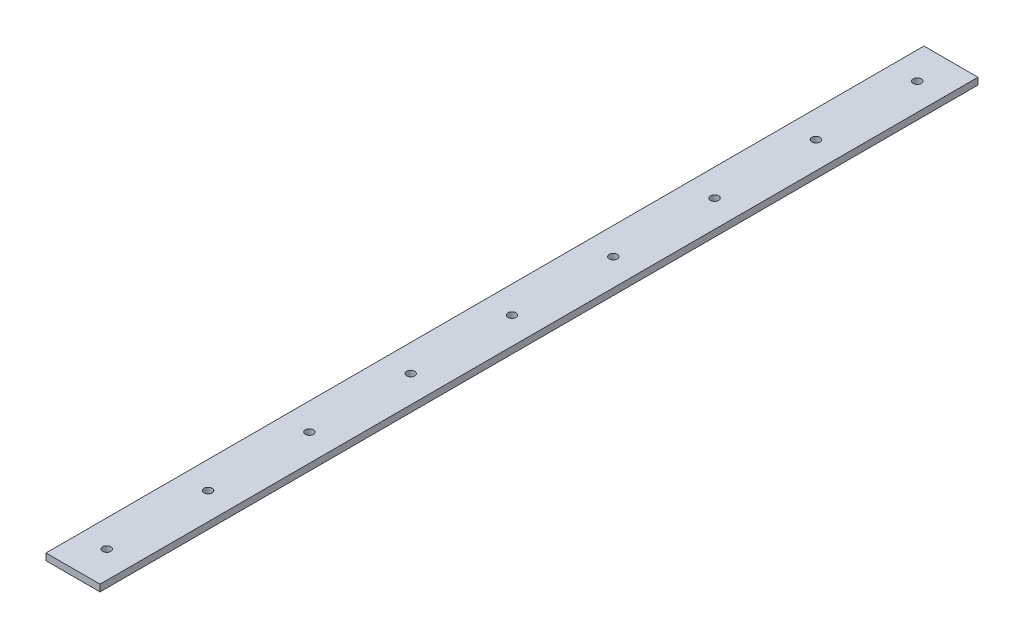
ISO-10303-21;
HEADER;
FILE_DESCRIPTION(('STEP AP214'),'2;1');
FILE_NAME('part.step','',(''),(''),'','','');
FILE_SCHEMA(('AUTOMOTIVE_DESIGN { 1 0 10303 214 1 1 1 1 }'));
ENDSEC;
DATA;
#1=APPLICATION_CONTEXT('core data for automotive mechanical design processes');
#2=APPLICATION_PROTOCOL_DEFINITION('international standard','automotive_design',2000,#1);
#3=PRODUCT_CONTEXT('',#1,'mechanical');
#4=PRODUCT('Part','Part','',(#3));
#5=PRODUCT_RELATED_PRODUCT_CATEGORY('part','',(#4));
#6=PRODUCT_DEFINITION_FORMATION('','',#4);
#7=PRODUCT_DEFINITION_CONTEXT('part definition',#1,'design');
#8=PRODUCT_DEFINITION('design','',#6,#7);
#9=PRODUCT_DEFINITION_SHAPE('','',#8);
#10=(LENGTH_UNIT() NAMED_UNIT(*) SI_UNIT(.MILLI.,.METRE.));
#11=(NAMED_UNIT(*) PLANE_ANGLE_UNIT() SI_UNIT($,.RADIAN.));
#12=(NAMED_UNIT(*) SI_UNIT($,.STERADIAN.) SOLID_ANGLE_UNIT());
#13=UNCERTAINTY_MEASURE_WITH_UNIT(LENGTH_MEASURE(1.E-05),#10,'distance_accuracy_value','');
#14=(GEOMETRIC_REPRESENTATION_CONTEXT(3) GLOBAL_UNCERTAINTY_ASSIGNED_CONTEXT((#13)) GLOBAL_UNIT_ASSIGNED_CONTEXT((#10,
#11,#12)) REPRESENTATION_CONTEXT('',''));
#15=CARTESIAN_POINT('',(0.,0.,0.));
#16=DIRECTION('',(0.,0.,1.));
#17=DIRECTION('',(1.,0.,0.));
#18=AXIS2_PLACEMENT_3D('',#15,#16,#17);
#19=CARTESIAN_POINT('',(20.,5.,325.));
#20=DIRECTION('',(-1.,0.,0.));
#21=DIRECTION('',(0.,0.,1.));
#22=AXIS2_PLACEMENT_3D('',#19,#20,#21);
#23=PLANE('',#22);
#24=DIRECTION('',(0.,0.,-1.));
#25=VECTOR('',#24,1.);
#26=CARTESIAN_POINT('',(20.,0.,325.));
#27=LINE('',#26,#25);
#28=CARTESIAN_POINT('',(20.,0.,325.));
#29=VERTEX_POINT('',#28);
#30=CARTESIAN_POINT('',(20.,0.,-325.));
#31=VERTEX_POINT('',#30);
#32=EDGE_CURVE('E186',#29,#31,#27,.T.);
#33=ORIENTED_EDGE('',*,*,#32,.T.);
#34=DIRECTION('',(0.,-1.,0.));
#35=VECTOR('',#34,1.);
#36=CARTESIAN_POINT('',(20.,5.,-325.));
#37=LINE('',#36,#35);
#38=CARTESIAN_POINT('',(20.,5.,-325.));
#39=VERTEX_POINT('',#38);
#40=EDGE_CURVE('E12',#39,#31,#37,.T.);
#41=ORIENTED_EDGE('',*,*,#40,.F.);
#42=DIRECTION('',(0.,0.,-1.));
#43=VECTOR('',#42,1.);
#44=CARTESIAN_POINT('',(20.,5.,325.));
#45=LINE('',#44,#43);
#46=CARTESIAN_POINT('',(20.,5.,325.));
#47=VERTEX_POINT('',#46);
#48=EDGE_CURVE('E90',#47,#39,#45,.T.);
#49=ORIENTED_EDGE('',*,*,#48,.F.);
#50=DIRECTION('',(0.,-1.,0.));
#51=VECTOR('',#50,1.);
#52=CARTESIAN_POINT('',(20.,5.,325.));
#53=LINE('',#52,#51);
#54=EDGE_CURVE('E99',#47,#29,#53,.T.);
#55=ORIENTED_EDGE('',*,*,#54,.T.);
#56=EDGE_LOOP('',(#33,#41,#49,#55));
#57=FACE_BOUND('',#56,.T.);
#58=ADVANCED_FACE('F37',(#57),#23,.F.);
#59=CARTESIAN_POINT('',(-20.,5.,-325.));
#60=DIRECTION('',(0.,0.,1.));
#61=DIRECTION('',(1.,0.,0.));
#62=AXIS2_PLACEMENT_3D('',#59,#60,#61);
#63=PLANE('',#62);
#64=DIRECTION('',(-1.,0.,0.));
#65=VECTOR('',#64,1.);
#66=CARTESIAN_POINT('',(-20.,0.,-325.));
#67=LINE('',#66,#65);
#68=CARTESIAN_POINT('',(-20.,0.,-325.));
#69=VERTEX_POINT('',#68);
#70=EDGE_CURVE('E94',#31,#69,#67,.T.);
#71=ORIENTED_EDGE('',*,*,#70,.T.);
#72=DIRECTION('',(0.,-1.,0.));
#73=VECTOR('',#72,1.);
#74=CARTESIAN_POINT('',(-20.,5.,-325.));
#75=LINE('',#74,#73);
#76=CARTESIAN_POINT('',(-20.,5.,-325.));
#77=VERTEX_POINT('',#76);
#78=EDGE_CURVE('E46',#77,#69,#75,.T.);
#79=ORIENTED_EDGE('',*,*,#78,.F.);
#80=DIRECTION('',(-1.,0.,0.));
#81=VECTOR('',#80,1.);
#82=CARTESIAN_POINT('',(-20.,5.,-325.));
#83=LINE('',#82,#81);
#84=EDGE_CURVE('E85',#39,#77,#83,.T.);
#85=ORIENTED_EDGE('',*,*,#84,.F.);
#86=ORIENTED_EDGE('',*,*,#40,.T.);
#87=EDGE_LOOP('',(#71,#79,#85,#86));
#88=FACE_BOUND('',#87,.T.);
#89=ADVANCED_FACE('F93',(#88),#63,.F.);
#90=CARTESIAN_POINT('',(-20.,5.,325.));
#91=DIRECTION('',(1.,0.,0.));
#92=DIRECTION('',(0.,0.,-1.));
#93=AXIS2_PLACEMENT_3D('',#90,#91,#92);
#94=PLANE('',#93);
#95=DIRECTION('',(0.,0.,1.));
#96=VECTOR('',#95,1.);
#97=CARTESIAN_POINT('',(-20.,0.,325.));
#98=LINE('',#97,#96);
#99=CARTESIAN_POINT('',(-20.,0.,325.));
#100=VERTEX_POINT('',#99);
#101=EDGE_CURVE('E72',#69,#100,#98,.T.);
#102=ORIENTED_EDGE('',*,*,#101,.T.);
#103=DIRECTION('',(0.,-1.,0.));
#104=VECTOR('',#103,1.);
#105=CARTESIAN_POINT('',(-20.,5.,325.));
#106=LINE('',#105,#104);
#107=CARTESIAN_POINT('',(-20.,5.,325.));
#108=VERTEX_POINT('',#107);
#109=EDGE_CURVE('E95',#108,#100,#106,.T.);
#110=ORIENTED_EDGE('',*,*,#109,.F.);
#111=DIRECTION('',(0.,0.,1.));
#112=VECTOR('',#111,1.);
#113=CARTESIAN_POINT('',(-20.,5.,325.));
#114=LINE('',#113,#112);
#115=EDGE_CURVE('E88',#77,#108,#114,.T.);
#116=ORIENTED_EDGE('',*,*,#115,.F.);
#117=ORIENTED_EDGE('',*,*,#78,.T.);
#118=EDGE_LOOP('',(#102,#110,#116,#117));
#119=FACE_BOUND('',#118,.T.);
#120=ADVANCED_FACE('F97',(#119),#94,.F.);
#121=CARTESIAN_POINT('',(-20.,5.,325.));
#122=DIRECTION('',(0.,0.,-1.));
#123=DIRECTION('',(-1.,0.,0.));
#124=AXIS2_PLACEMENT_3D('',#121,#122,#123);
#125=PLANE('',#124);
#126=DIRECTION('',(1.,0.,0.));
#127=VECTOR('',#126,1.);
#128=CARTESIAN_POINT('',(-20.,0.,325.));
#129=LINE('',#128,#127);
#130=EDGE_CURVE('E78',#100,#29,#129,.T.);
#131=ORIENTED_EDGE('',*,*,#130,.T.);
#132=ORIENTED_EDGE('',*,*,#54,.F.);
#133=DIRECTION('',(1.,0.,0.));
#134=VECTOR('',#133,1.);
#135=CARTESIAN_POINT('',(-20.,5.,325.));
#136=LINE('',#135,#134);
#137=EDGE_CURVE('E55',#108,#47,#136,.T.);
#138=ORIENTED_EDGE('',*,*,#137,.F.);
#139=ORIENTED_EDGE('',*,*,#109,.T.);
#140=EDGE_LOOP('',(#131,#132,#138,#139));
#141=FACE_BOUND('',#140,.T.);
#142=ADVANCED_FACE('F159',(#141),#125,.F.);
#143=CARTESIAN_POINT('',(0.,5.,0.));
#144=DIRECTION('',(0.,-1.,0.));
#145=DIRECTION('',(0.,0.,-1.));
#146=AXIS2_PLACEMENT_3D('',#143,#144,#145);
#147=PLANE('',#146);
#148=CARTESIAN_POINT('',(0.,5.,75.));
#149=DIRECTION('',(0.,1.,0.));
#150=DIRECTION('',(0.,0.,-1.));
#151=AXIS2_PLACEMENT_3D('',#148,#149,#150);
#152=CIRCLE('',#151,3.);
#153=CARTESIAN_POINT('',(0.,5.,72.));
#154=VERTEX_POINT('',#153);
#155=EDGE_CURVE('E117',#154,#154,#152,.T.);
#156=ORIENTED_EDGE('',*,*,#155,.F.);
#157=EDGE_LOOP('',(#156));
#158=FACE_BOUND('',#157,.T.);
#159=CARTESIAN_POINT('',(0.,5.,150.));
#160=DIRECTION('',(0.,1.,0.));
#161=DIRECTION('',(0.,0.,-1.));
#162=AXIS2_PLACEMENT_3D('',#159,#160,#161);
#163=CIRCLE('',#162,3.);
#164=CARTESIAN_POINT('',(0.,5.,147.));
#165=VERTEX_POINT('',#164);
#166=EDGE_CURVE('E121',#165,#165,#163,.T.);
#167=ORIENTED_EDGE('',*,*,#166,.F.);
#168=EDGE_LOOP('',(#167));
#169=FACE_BOUND('',#168,.T.);
#170=CARTESIAN_POINT('',(0.,5.,225.));
#171=DIRECTION('',(0.,1.,0.));
#172=DIRECTION('',(0.,0.,-1.));
#173=AXIS2_PLACEMENT_3D('',#170,#171,#172);
#174=CIRCLE('',#173,3.);
#175=CARTESIAN_POINT('',(0.,5.,222.));
#176=VERTEX_POINT('',#175);
#177=EDGE_CURVE('E130',#176,#176,#174,.T.);
#178=ORIENTED_EDGE('',*,*,#177,.F.);
#179=EDGE_LOOP('',(#178));
#180=FACE_BOUND('',#179,.T.);
#181=CARTESIAN_POINT('',(0.,5.,300.));
#182=DIRECTION('',(0.,1.,0.));
#183=DIRECTION('',(0.,0.,-1.));
#184=AXIS2_PLACEMENT_3D('',#181,#182,#183);
#185=CIRCLE('',#184,3.);
#186=CARTESIAN_POINT('',(0.,5.,297.));
#187=VERTEX_POINT('',#186);
#188=EDGE_CURVE('E133',#187,#187,#185,.T.);
#189=ORIENTED_EDGE('',*,*,#188,.F.);
#190=EDGE_LOOP('',(#189));
#191=FACE_BOUND('',#190,.T.);
#192=CARTESIAN_POINT('',(0.,5.,-300.));
#193=DIRECTION('',(0.,1.,0.));
#194=DIRECTION('',(0.,0.,1.));
#195=AXIS2_PLACEMENT_3D('',#192,#193,#194);
#196=CIRCLE('',#195,3.);
#197=CARTESIAN_POINT('',(0.,5.,-297.));
#198=VERTEX_POINT('',#197);
#199=EDGE_CURVE('E137',#198,#198,#196,.T.);
#200=ORIENTED_EDGE('',*,*,#199,.F.);
#201=EDGE_LOOP('',(#200));
#202=FACE_BOUND('',#201,.T.);
#203=CARTESIAN_POINT('',(0.,5.,-225.));
#204=DIRECTION('',(0.,1.,0.));
#205=DIRECTION('',(0.,0.,1.));
#206=AXIS2_PLACEMENT_3D('',#203,#204,#205);
#207=CIRCLE('',#206,3.);
#208=CARTESIAN_POINT('',(0.,5.,-222.));
#209=VERTEX_POINT('',#208);
#210=EDGE_CURVE('E141',#209,#209,#207,.T.);
#211=ORIENTED_EDGE('',*,*,#210,.F.);
#212=EDGE_LOOP('',(#211));
#213=FACE_BOUND('',#212,.T.);
#214=CARTESIAN_POINT('',(0.,5.,-150.));
#215=DIRECTION('',(0.,1.,0.));
#216=DIRECTION('',(0.,0.,1.));
#217=AXIS2_PLACEMENT_3D('',#214,#215,#216);
#218=CIRCLE('',#217,3.);
#219=CARTESIAN_POINT('',(0.,5.,-147.));
#220=VERTEX_POINT('',#219);
#221=EDGE_CURVE('E147',#220,#220,#218,.T.);
#222=ORIENTED_EDGE('',*,*,#221,.F.);
#223=EDGE_LOOP('',(#222));
#224=FACE_BOUND('',#223,.T.);
#225=CARTESIAN_POINT('',(0.,5.,-75.));
#226=DIRECTION('',(0.,1.,0.));
#227=DIRECTION('',(0.,0.,1.));
#228=AXIS2_PLACEMENT_3D('',#225,#226,#227);
#229=CIRCLE('',#228,3.);
#230=CARTESIAN_POINT('',(0.,5.,-72.));
#231=VERTEX_POINT('',#230);
#232=EDGE_CURVE('E116',#231,#231,#229,.T.);
#233=ORIENTED_EDGE('',*,*,#232,.F.);
#234=EDGE_LOOP('',(#233));
#235=FACE_BOUND('',#234,.T.);
#236=CARTESIAN_POINT('',(0.,5.,0.));
#237=DIRECTION('',(0.,1.,0.));
#238=DIRECTION('',(0.,0.,1.));
#239=AXIS2_PLACEMENT_3D('',#236,#237,#238);
#240=CIRCLE('',#239,3.);
#241=CARTESIAN_POINT('',(0.,5.,3.));
#242=VERTEX_POINT('',#241);
#243=EDGE_CURVE('E111',#242,#242,#240,.T.);
#244=ORIENTED_EDGE('',*,*,#243,.F.);
#245=EDGE_LOOP('',(#244));
#246=FACE_BOUND('',#245,.T.);
#247=ORIENTED_EDGE('',*,*,#48,.T.);
#248=ORIENTED_EDGE('',*,*,#84,.T.);
#249=ORIENTED_EDGE('',*,*,#115,.T.);
#250=ORIENTED_EDGE('',*,*,#137,.T.);
#251=EDGE_LOOP('',(#247,#248,#249,#250));
#252=FACE_BOUND('',#251,.T.);
#253=ADVANCED_FACE('F86',(#158,#169,#180,#191,#202,#213,#224,#235,#246,#252),#147,.F.);
#254=CARTESIAN_POINT('',(0.,0.,0.));
#255=DIRECTION('',(0.,-1.,0.));
#256=DIRECTION('',(0.,0.,-1.));
#257=AXIS2_PLACEMENT_3D('',#254,#255,#256);
#258=PLANE('',#257);
#259=CARTESIAN_POINT('',(0.,0.,75.));
#260=DIRECTION('',(0.,-1.,0.));
#261=DIRECTION('',(0.,0.,-1.));
#262=AXIS2_PLACEMENT_3D('',#259,#260,#261);
#263=CIRCLE('',#262,3.);
#264=CARTESIAN_POINT('',(0.,0.,72.));
#265=VERTEX_POINT('',#264);
#266=EDGE_CURVE('E40',#265,#265,#263,.F.);
#267=ORIENTED_EDGE('',*,*,#266,.T.);
#268=EDGE_LOOP('',(#267));
#269=FACE_BOUND('',#268,.T.);
#270=CARTESIAN_POINT('',(0.,0.,150.));
#271=DIRECTION('',(0.,-1.,0.));
#272=DIRECTION('',(0.,0.,-1.));
#273=AXIS2_PLACEMENT_3D('',#270,#271,#272);
#274=CIRCLE('',#273,3.);
#275=CARTESIAN_POINT('',(0.,0.,147.));
#276=VERTEX_POINT('',#275);
#277=EDGE_CURVE('E190',#276,#276,#274,.F.);
#278=ORIENTED_EDGE('',*,*,#277,.T.);
#279=EDGE_LOOP('',(#278));
#280=FACE_BOUND('',#279,.T.);
#281=CARTESIAN_POINT('',(0.,0.,225.));
#282=DIRECTION('',(0.,-1.,0.));
#283=DIRECTION('',(0.,0.,-1.));
#284=AXIS2_PLACEMENT_3D('',#281,#282,#283);
#285=CIRCLE('',#284,3.);
#286=CARTESIAN_POINT('',(0.,0.,222.));
#287=VERTEX_POINT('',#286);
#288=EDGE_CURVE('E213',#287,#287,#285,.F.);
#289=ORIENTED_EDGE('',*,*,#288,.T.);
#290=EDGE_LOOP('',(#289));
#291=FACE_BOUND('',#290,.T.);
#292=CARTESIAN_POINT('',(0.,0.,300.));
#293=DIRECTION('',(0.,-1.,0.));
#294=DIRECTION('',(0.,0.,-1.));
#295=AXIS2_PLACEMENT_3D('',#292,#293,#294);
#296=CIRCLE('',#295,3.);
#297=CARTESIAN_POINT('',(0.,0.,297.));
#298=VERTEX_POINT('',#297);
#299=EDGE_CURVE('E210',#298,#298,#296,.F.);
#300=ORIENTED_EDGE('',*,*,#299,.T.);
#301=EDGE_LOOP('',(#300));
#302=FACE_BOUND('',#301,.T.);
#303=CARTESIAN_POINT('',(0.,0.,-300.));
#304=DIRECTION('',(0.,-1.,0.));
#305=DIRECTION('',(0.,0.,-1.));
#306=AXIS2_PLACEMENT_3D('',#303,#304,#305);
#307=CIRCLE('',#306,3.);
#308=CARTESIAN_POINT('',(0.,0.,-303.));
#309=VERTEX_POINT('',#308);
#310=EDGE_CURVE('E207',#309,#309,#307,.F.);
#311=ORIENTED_EDGE('',*,*,#310,.T.);
#312=EDGE_LOOP('',(#311));
#313=FACE_BOUND('',#312,.T.);
#314=CARTESIAN_POINT('',(0.,0.,-225.));
#315=DIRECTION('',(0.,-1.,0.));
#316=DIRECTION('',(0.,0.,-1.));
#317=AXIS2_PLACEMENT_3D('',#314,#315,#316);
#318=CIRCLE('',#317,3.);
#319=CARTESIAN_POINT('',(0.,0.,-228.));
#320=VERTEX_POINT('',#319);
#321=EDGE_CURVE('E204',#320,#320,#318,.F.);
#322=ORIENTED_EDGE('',*,*,#321,.T.);
#323=EDGE_LOOP('',(#322));
#324=FACE_BOUND('',#323,.T.);
#325=CARTESIAN_POINT('',(0.,0.,-150.));
#326=DIRECTION('',(0.,-1.,0.));
#327=DIRECTION('',(0.,0.,-1.));
#328=AXIS2_PLACEMENT_3D('',#325,#326,#327);
#329=CIRCLE('',#328,3.);
#330=CARTESIAN_POINT('',(0.,0.,-153.));
#331=VERTEX_POINT('',#330);
#332=EDGE_CURVE('E201',#331,#331,#329,.F.);
#333=ORIENTED_EDGE('',*,*,#332,.T.);
#334=EDGE_LOOP('',(#333));
#335=FACE_BOUND('',#334,.T.);
#336=CARTESIAN_POINT('',(0.,0.,-75.));
#337=DIRECTION('',(0.,-1.,0.));
#338=DIRECTION('',(0.,0.,-1.));
#339=AXIS2_PLACEMENT_3D('',#336,#337,#338);
#340=CIRCLE('',#339,3.);
#341=CARTESIAN_POINT('',(0.,0.,-78.));
#342=VERTEX_POINT('',#341);
#343=EDGE_CURVE('E198',#342,#342,#340,.F.);
#344=ORIENTED_EDGE('',*,*,#343,.T.);
#345=EDGE_LOOP('',(#344));
#346=FACE_BOUND('',#345,.T.);
#347=CARTESIAN_POINT('',(0.,0.,0.));
#348=DIRECTION('',(0.,-1.,0.));
#349=DIRECTION('',(0.,0.,-1.));
#350=AXIS2_PLACEMENT_3D('',#347,#348,#349);
#351=CIRCLE('',#350,3.);
#352=CARTESIAN_POINT('',(0.,0.,-3.));
#353=VERTEX_POINT('',#352);
#354=EDGE_CURVE('E115',#353,#353,#351,.F.);
#355=ORIENTED_EDGE('',*,*,#354,.T.);
#356=EDGE_LOOP('',(#355));
#357=FACE_BOUND('',#356,.T.);
#358=ORIENTED_EDGE('',*,*,#32,.F.);
#359=ORIENTED_EDGE('',*,*,#130,.F.);
#360=ORIENTED_EDGE('',*,*,#101,.F.);
#361=ORIENTED_EDGE('',*,*,#70,.F.);
#362=EDGE_LOOP('',(#358,#359,#360,#361));
#363=FACE_BOUND('',#362,.T.);
#364=ADVANCED_FACE('F158',(#269,#280,#291,#302,#313,#324,#335,#346,#357,#363),#258,.T.);
#365=CARTESIAN_POINT('',(0.,5.,0.));
#366=DIRECTION('',(0.,-1.,0.));
#367=DIRECTION('',(0.,0.,-1.));
#368=AXIS2_PLACEMENT_3D('',#365,#366,#367);
#369=CYLINDRICAL_SURFACE('',#368,3.);
#370=ORIENTED_EDGE('',*,*,#354,.F.);
#371=EDGE_LOOP('',(#370));
#372=FACE_BOUND('',#371,.T.);
#373=ORIENTED_EDGE('',*,*,#243,.T.);
#374=EDGE_LOOP('',(#373));
#375=FACE_BOUND('',#374,.T.);
#376=ADVANCED_FACE('F164',(#372,#375),#369,.F.);
#377=CARTESIAN_POINT('',(0.,5.,-75.));
#378=DIRECTION('',(0.,-1.,0.));
#379=DIRECTION('',(0.,0.,-1.));
#380=AXIS2_PLACEMENT_3D('',#377,#378,#379);
#381=CYLINDRICAL_SURFACE('',#380,3.);
#382=ORIENTED_EDGE('',*,*,#343,.F.);
#383=EDGE_LOOP('',(#382));
#384=FACE_BOUND('',#383,.T.);
#385=ORIENTED_EDGE('',*,*,#232,.T.);
#386=EDGE_LOOP('',(#385));
#387=FACE_BOUND('',#386,.T.);
#388=ADVANCED_FACE('F154',(#384,#387),#381,.F.);
#389=CARTESIAN_POINT('',(0.,5.,-150.));
#390=DIRECTION('',(0.,-1.,0.));
#391=DIRECTION('',(0.,0.,-1.));
#392=AXIS2_PLACEMENT_3D('',#389,#390,#391);
#393=CYLINDRICAL_SURFACE('',#392,3.);
#394=ORIENTED_EDGE('',*,*,#332,.F.);
#395=EDGE_LOOP('',(#394));
#396=FACE_BOUND('',#395,.T.);
#397=ORIENTED_EDGE('',*,*,#221,.T.);
#398=EDGE_LOOP('',(#397));
#399=FACE_BOUND('',#398,.T.);
#400=ADVANCED_FACE('F172',(#396,#399),#393,.F.);
#401=CARTESIAN_POINT('',(0.,5.,-225.));
#402=DIRECTION('',(0.,-1.,0.));
#403=DIRECTION('',(0.,0.,-1.));
#404=AXIS2_PLACEMENT_3D('',#401,#402,#403);
#405=CYLINDRICAL_SURFACE('',#404,3.);
#406=ORIENTED_EDGE('',*,*,#321,.F.);
#407=EDGE_LOOP('',(#406));
#408=FACE_BOUND('',#407,.T.);
#409=ORIENTED_EDGE('',*,*,#210,.T.);
#410=EDGE_LOOP('',(#409));
#411=FACE_BOUND('',#410,.T.);
#412=ADVANCED_FACE('F242',(#408,#411),#405,.F.);
#413=CARTESIAN_POINT('',(0.,5.,-300.));
#414=DIRECTION('',(0.,-1.,0.));
#415=DIRECTION('',(0.,0.,-1.));
#416=AXIS2_PLACEMENT_3D('',#413,#414,#415);
#417=CYLINDRICAL_SURFACE('',#416,3.);
#418=ORIENTED_EDGE('',*,*,#310,.F.);
#419=EDGE_LOOP('',(#418));
#420=FACE_BOUND('',#419,.T.);
#421=ORIENTED_EDGE('',*,*,#199,.T.);
#422=EDGE_LOOP('',(#421));
#423=FACE_BOUND('',#422,.T.);
#424=ADVANCED_FACE('F248',(#420,#423),#417,.F.);
#425=CARTESIAN_POINT('',(0.,5.,300.));
#426=DIRECTION('',(0.,-1.,0.));
#427=DIRECTION('',(0.,0.,-1.));
#428=AXIS2_PLACEMENT_3D('',#425,#426,#427);
#429=CYLINDRICAL_SURFACE('',#428,3.);
#430=ORIENTED_EDGE('',*,*,#299,.F.);
#431=EDGE_LOOP('',(#430));
#432=FACE_BOUND('',#431,.T.);
#433=ORIENTED_EDGE('',*,*,#188,.T.);
#434=EDGE_LOOP('',(#433));
#435=FACE_BOUND('',#434,.T.);
#436=ADVANCED_FACE('F255',(#432,#435),#429,.F.);
#437=CARTESIAN_POINT('',(0.,5.,225.));
#438=DIRECTION('',(0.,-1.,0.));
#439=DIRECTION('',(0.,0.,-1.));
#440=AXIS2_PLACEMENT_3D('',#437,#438,#439);
#441=CYLINDRICAL_SURFACE('',#440,3.);
#442=ORIENTED_EDGE('',*,*,#288,.F.);
#443=EDGE_LOOP('',(#442));
#444=FACE_BOUND('',#443,.T.);
#445=ORIENTED_EDGE('',*,*,#177,.T.);
#446=EDGE_LOOP('',(#445));
#447=FACE_BOUND('',#446,.T.);
#448=ADVANCED_FACE('F224',(#444,#447),#441,.F.);
#449=CARTESIAN_POINT('',(0.,5.,150.));
#450=DIRECTION('',(0.,-1.,0.));
#451=DIRECTION('',(0.,0.,-1.));
#452=AXIS2_PLACEMENT_3D('',#449,#450,#451);
#453=CYLINDRICAL_SURFACE('',#452,3.);
#454=ORIENTED_EDGE('',*,*,#277,.F.);
#455=EDGE_LOOP('',(#454));
#456=FACE_BOUND('',#455,.T.);
#457=ORIENTED_EDGE('',*,*,#166,.T.);
#458=EDGE_LOOP('',(#457));
#459=FACE_BOUND('',#458,.T.);
#460=ADVANCED_FACE('F220',(#456,#459),#453,.F.);
#461=CARTESIAN_POINT('',(0.,5.,75.));
#462=DIRECTION('',(0.,-1.,0.));
#463=DIRECTION('',(0.,0.,-1.));
#464=AXIS2_PLACEMENT_3D('',#461,#462,#463);
#465=CYLINDRICAL_SURFACE('',#464,3.);
#466=ORIENTED_EDGE('',*,*,#266,.F.);
#467=EDGE_LOOP('',(#466));
#468=FACE_BOUND('',#467,.T.);
#469=ORIENTED_EDGE('',*,*,#155,.T.);
#470=EDGE_LOOP('',(#469));
#471=FACE_BOUND('',#470,.T.);
#472=ADVANCED_FACE('F223',(#468,#471),#465,.F.);
#473=CLOSED_SHELL('',(#58,#89,#120,#142,#253,#364,#376,#388,#400,#412,#424,#436,#448,#460,#472));
#474=MANIFOLD_SOLID_BREP('B2',#473);
#475=ADVANCED_BREP_SHAPE_REPRESENTATION('',(#18,#474),#14);
#476=SHAPE_DEFINITION_REPRESENTATION(#9,#475);
ENDSEC;
END-ISO-10303-21;
